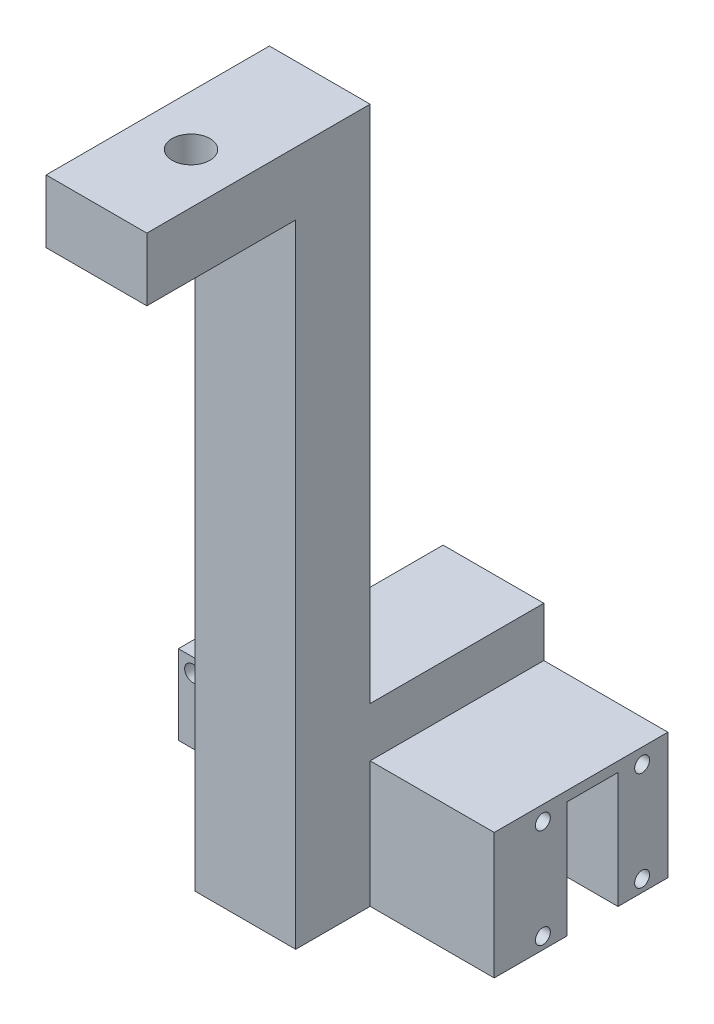
ISO-10303-21;
HEADER;
FILE_DESCRIPTION(('STEP AP214'),'2;1');
FILE_NAME('part.step','',(''),(''),'','','');
FILE_SCHEMA(('AUTOMOTIVE_DESIGN { 1 0 10303 214 1 1 1 1 }'));
ENDSEC;
DATA;
#1=APPLICATION_CONTEXT('core data for automotive mechanical design processes');
#2=APPLICATION_PROTOCOL_DEFINITION('international standard','automotive_design',2000,#1);
#3=PRODUCT_CONTEXT('',#1,'mechanical');
#4=PRODUCT('Part','Part','',(#3));
#5=PRODUCT_RELATED_PRODUCT_CATEGORY('part','',(#4));
#6=PRODUCT_DEFINITION_FORMATION('','',#4);
#7=PRODUCT_DEFINITION_CONTEXT('part definition',#1,'design');
#8=PRODUCT_DEFINITION('design','',#6,#7);
#9=PRODUCT_DEFINITION_SHAPE('','',#8);
#10=(LENGTH_UNIT() NAMED_UNIT(*) SI_UNIT(.MILLI.,.METRE.));
#11=(NAMED_UNIT(*) PLANE_ANGLE_UNIT() SI_UNIT($,.RADIAN.));
#12=(NAMED_UNIT(*) SI_UNIT($,.STERADIAN.) SOLID_ANGLE_UNIT());
#13=UNCERTAINTY_MEASURE_WITH_UNIT(LENGTH_MEASURE(1.E-05),#10,'distance_accuracy_value','');
#14=(GEOMETRIC_REPRESENTATION_CONTEXT(3) GLOBAL_UNCERTAINTY_ASSIGNED_CONTEXT((#13)) GLOBAL_UNIT_ASSIGNED_CONTEXT((#10,
#11,#12)) REPRESENTATION_CONTEXT('',''));
#15=CARTESIAN_POINT('',(0.,0.,0.));
#16=DIRECTION('',(0.,0.,1.));
#17=DIRECTION('',(1.,0.,0.));
#18=AXIS2_PLACEMENT_3D('',#15,#16,#17);
#19=CARTESIAN_POINT('',(5.,0.,30.));
#20=DIRECTION('',(0.,0.,1.));
#21=DIRECTION('',(1.,0.,0.));
#22=AXIS2_PLACEMENT_3D('',#19,#20,#21);
#23=PLANE('',#22);
#24=DIRECTION('',(0.,1.,0.));
#25=VECTOR('',#24,1.);
#26=CARTESIAN_POINT('',(20.3,0.,30.));
#27=LINE('',#26,#25);
#28=CARTESIAN_POINT('',(20.3,35.4,30.));
#29=VERTEX_POINT('',#28);
#30=CARTESIAN_POINT('',(20.3,140.,30.));
#31=VERTEX_POINT('',#30);
#32=EDGE_CURVE('E885',#29,#31,#27,.T.);
#33=ORIENTED_EDGE('',*,*,#32,.F.);
#34=DIRECTION('',(-1.,0.,0.));
#35=VECTOR('',#34,1.);
#36=CARTESIAN_POINT('',(5.,35.4,30.));
#37=LINE('',#36,#35);
#38=CARTESIAN_POINT('',(0.,35.4,30.));
#39=VERTEX_POINT('',#38);
#40=EDGE_CURVE('E957',#29,#39,#37,.T.);
#41=ORIENTED_EDGE('',*,*,#40,.T.);
#42=DIRECTION('',(0.,1.,0.));
#43=VECTOR('',#42,1.);
#44=CARTESIAN_POINT('',(0.,0.,30.));
#45=LINE('',#44,#43);
#46=CARTESIAN_POINT('',(0.,140.,30.));
#47=VERTEX_POINT('',#46);
#48=EDGE_CURVE('E939',#39,#47,#45,.T.);
#49=ORIENTED_EDGE('',*,*,#48,.T.);
#50=DIRECTION('',(-1.,0.,0.));
#51=VECTOR('',#50,1.);
#52=CARTESIAN_POINT('',(5.,140.,30.));
#53=LINE('',#52,#51);
#54=EDGE_CURVE('E954',#31,#47,#53,.T.);
#55=ORIENTED_EDGE('',*,*,#54,.F.);
#56=EDGE_LOOP('',(#33,#41,#49,#55));
#57=FACE_BOUND('',#56,.T.);
#58=ADVANCED_FACE('F537',(#57),#23,.F.);
#59=CARTESIAN_POINT('',(20.3,0.,0.));
#60=DIRECTION('',(-1.,0.,0.));
#61=DIRECTION('',(0.,0.,1.));
#62=AXIS2_PLACEMENT_3D('',#59,#60,#61);
#63=PLANE('',#62);
#64=DIRECTION('',(0.,-1.,0.));
#65=VECTOR('',#64,1.);
#66=CARTESIAN_POINT('',(20.3,0.,5.05));
#67=LINE('',#66,#65);
#68=CARTESIAN_POINT('',(20.3,18.4,5.05));
#69=VERTEX_POINT('',#68);
#70=CARTESIAN_POINT('',(20.3,15.,5.05));
#71=VERTEX_POINT('',#70);
#72=EDGE_CURVE('E12',#69,#71,#67,.T.);
#73=ORIENTED_EDGE('',*,*,#72,.F.);
#74=DIRECTION('',(0.,0.,-1.));
#75=VECTOR('',#74,1.);
#76=CARTESIAN_POINT('',(20.3,18.4,0.));
#77=LINE('',#76,#75);
#78=CARTESIAN_POINT('',(20.3,18.4,15.35));
#79=VERTEX_POINT('',#78);
#80=EDGE_CURVE('E874',#79,#69,#77,.T.);
#81=ORIENTED_EDGE('',*,*,#80,.F.);
#82=DIRECTION('',(0.,1.,0.));
#83=VECTOR('',#82,1.);
#84=CARTESIAN_POINT('',(20.3,0.,15.35));
#85=LINE('',#84,#83);
#86=CARTESIAN_POINT('',(20.3,15.,15.35));
#87=VERTEX_POINT('',#86);
#88=EDGE_CURVE('E546',#87,#79,#85,.T.);
#89=ORIENTED_EDGE('',*,*,#88,.F.);
#90=DIRECTION('',(0.,0.,-1.));
#91=VECTOR('',#90,1.);
#92=CARTESIAN_POINT('',(20.3,15.,0.));
#93=LINE('',#92,#91);
#94=EDGE_CURVE('E902',#87,#71,#93,.T.);
#95=ORIENTED_EDGE('',*,*,#94,.T.);
#96=EDGE_LOOP('',(#73,#81,#89,#95));
#97=FACE_BOUND('',#96,.T.);
#98=ADVANCED_FACE('F1010',(#97),#63,.F.);
#99=CARTESIAN_POINT('',(0.,0.,0.));
#100=DIRECTION('',(1.,0.,0.));
#101=DIRECTION('',(0.,0.,-1.));
#102=AXIS2_PLACEMENT_3D('',#99,#100,#101);
#103=PLANE('',#102);
#104=CARTESIAN_POINT('',(0.,22.4,0.194999999999997));
#105=DIRECTION('',(1.,0.,0.));
#106=DIRECTION('',(0.,0.,-1.));
#107=AXIS2_PLACEMENT_3D('',#104,#105,#106);
#108=CIRCLE('',#107,1.5);
#109=CARTESIAN_POINT('',(0.,22.4,-1.305));
#110=VERTEX_POINT('',#109);
#111=EDGE_CURVE('E910',#110,#110,#108,.T.);
#112=ORIENTED_EDGE('',*,*,#111,.T.);
#113=EDGE_LOOP('',(#112));
#114=FACE_BOUND('',#113,.T.);
#115=CARTESIAN_POINT('',(0.,22.4,20.195));
#116=DIRECTION('',(1.,0.,0.));
#117=DIRECTION('',(0.,0.,-1.));
#118=AXIS2_PLACEMENT_3D('',#115,#116,#117);
#119=CIRCLE('',#118,1.5);
#120=CARTESIAN_POINT('',(0.,22.4,18.695));
#121=VERTEX_POINT('',#120);
#122=EDGE_CURVE('E949',#121,#121,#119,.T.);
#123=ORIENTED_EDGE('',*,*,#122,.T.);
#124=EDGE_LOOP('',(#123));
#125=FACE_BOUND('',#124,.T.);
#126=ORIENTED_EDGE('',*,*,#48,.F.);
#127=DIRECTION('',(0.,0.,1.));
#128=VECTOR('',#127,1.);
#129=CARTESIAN_POINT('',(0.,35.4,0.));
#130=LINE('',#129,#128);
#131=CARTESIAN_POINT('',(0.,35.4,-5.));
#132=VERTEX_POINT('',#131);
#133=EDGE_CURVE('E936',#132,#39,#130,.T.);
#134=ORIENTED_EDGE('',*,*,#133,.F.);
#135=DIRECTION('',(0.,1.,0.));
#136=VECTOR('',#135,1.);
#137=CARTESIAN_POINT('',(0.,0.,-5.));
#138=LINE('',#137,#136);
#139=CARTESIAN_POINT('',(0.,0.,-5.));
#140=VERTEX_POINT('',#139);
#141=EDGE_CURVE('E934',#140,#132,#138,.T.);
#142=ORIENTED_EDGE('',*,*,#141,.F.);
#143=DIRECTION('',(0.,0.,-1.));
#144=VECTOR('',#143,1.);
#145=CARTESIAN_POINT('',(0.,0.,0.));
#146=LINE('',#145,#144);
#147=CARTESIAN_POINT('',(0.,0.,0.));
#148=VERTEX_POINT('',#147);
#149=EDGE_CURVE('E734',#148,#140,#146,.T.);
#150=ORIENTED_EDGE('',*,*,#149,.F.);
#151=DIRECTION('',(0.,-1.,0.));
#152=VECTOR('',#151,1.);
#153=CARTESIAN_POINT('',(0.,0.,0.));
#154=LINE('',#153,#152);
#155=CARTESIAN_POINT('',(0.,0.912729009225285,0.));
#156=VERTEX_POINT('',#155);
#157=EDGE_CURVE('E780',#156,#148,#154,.T.);
#158=ORIENTED_EDGE('',*,*,#157,.F.);
#159=CARTESIAN_POINT('',(0.,2.4,0.194999999999997));
#160=DIRECTION('',(1.,0.,0.));
#161=DIRECTION('',(0.,0.,-1.));
#162=AXIS2_PLACEMENT_3D('',#159,#160,#161);
#163=CIRCLE('',#162,1.5);
#164=CARTESIAN_POINT('',(0.,3.88727099077471,0.));
#165=VERTEX_POINT('',#164);
#166=EDGE_CURVE('E907',#156,#165,#163,.T.);
#167=ORIENTED_EDGE('',*,*,#166,.T.);
#168=CARTESIAN_POINT('',(0.,16.,0.));
#169=VERTEX_POINT('',#168);
#170=EDGE_CURVE('E863',#169,#165,#154,.T.);
#171=ORIENTED_EDGE('',*,*,#170,.F.);
#172=DIRECTION('',(0.,0.,-1.));
#173=VECTOR('',#172,1.);
#174=CARTESIAN_POINT('',(0.,16.,5.));
#175=LINE('',#174,#173);
#176=CARTESIAN_POINT('',(0.,16.,5.));
#177=VERTEX_POINT('',#176);
#178=EDGE_CURVE('E851',#177,#169,#175,.T.);
#179=ORIENTED_EDGE('',*,*,#178,.F.);
#180=DIRECTION('',(0.,-1.,0.));
#181=VECTOR('',#180,1.);
#182=CARTESIAN_POINT('',(0.,0.,5.));
#183=LINE('',#182,#181);
#184=CARTESIAN_POINT('',(0.,0.,5.));
#185=VERTEX_POINT('',#184);
#186=EDGE_CURVE('E845',#177,#185,#183,.T.);
#187=ORIENTED_EDGE('',*,*,#186,.T.);
#188=CARTESIAN_POINT('',(0.,0.,5.05));
#189=VERTEX_POINT('',#188);
#190=EDGE_CURVE('E932',#189,#185,#146,.T.);
#191=ORIENTED_EDGE('',*,*,#190,.F.);
#192=DIRECTION('',(0.,-1.,0.));
#193=VECTOR('',#192,1.);
#194=CARTESIAN_POINT('',(0.,0.,5.05));
#195=LINE('',#194,#193);
#196=CARTESIAN_POINT('',(0.,23.4,5.05));
#197=VERTEX_POINT('',#196);
#198=EDGE_CURVE('E929',#197,#189,#195,.T.);
#199=ORIENTED_EDGE('',*,*,#198,.F.);
#200=DIRECTION('',(0.,0.,-1.));
#201=VECTOR('',#200,1.);
#202=CARTESIAN_POINT('',(0.,23.4,0.));
#203=LINE('',#202,#201);
#204=CARTESIAN_POINT('',(0.,23.4,15.35));
#205=VERTEX_POINT('',#204);
#206=EDGE_CURVE('E926',#205,#197,#203,.T.);
#207=ORIENTED_EDGE('',*,*,#206,.F.);
#208=DIRECTION('',(0.,1.,0.));
#209=VECTOR('',#208,1.);
#210=CARTESIAN_POINT('',(0.,0.,15.35));
#211=LINE('',#210,#209);
#212=CARTESIAN_POINT('',(0.,16.,15.35));
#213=VERTEX_POINT('',#212);
#214=EDGE_CURVE('E924',#213,#205,#211,.T.);
#215=ORIENTED_EDGE('',*,*,#214,.F.);
#216=DIRECTION('',(0.,0.,-1.));
#217=VECTOR('',#216,1.);
#218=CARTESIAN_POINT('',(0.,16.,20.35));
#219=LINE('',#218,#217);
#220=CARTESIAN_POINT('',(0.,16.,20.35));
#221=VERTEX_POINT('',#220);
#222=EDGE_CURVE('E826',#221,#213,#219,.T.);
#223=ORIENTED_EDGE('',*,*,#222,.F.);
#224=DIRECTION('',(0.,1.,0.));
#225=VECTOR('',#224,1.);
#226=CARTESIAN_POINT('',(0.,0.,20.35));
#227=LINE('',#226,#225);
#228=CARTESIAN_POINT('',(0.,3.89197017396461,20.35));
#229=VERTEX_POINT('',#228);
#230=EDGE_CURVE('E816',#229,#221,#227,.T.);
#231=ORIENTED_EDGE('',*,*,#230,.F.);
#232=CARTESIAN_POINT('',(0.,2.4,20.195));
#233=DIRECTION('',(1.,0.,0.));
#234=DIRECTION('',(0.,0.,-1.));
#235=AXIS2_PLACEMENT_3D('',#232,#233,#234);
#236=CIRCLE('',#235,1.5);
#237=CARTESIAN_POINT('',(0.,0.908029826035385,20.35));
#238=VERTEX_POINT('',#237);
#239=EDGE_CURVE('E946',#229,#238,#236,.T.);
#240=ORIENTED_EDGE('',*,*,#239,.T.);
#241=CARTESIAN_POINT('',(0.,0.,20.35));
#242=VERTEX_POINT('',#241);
#243=EDGE_CURVE('E817',#242,#238,#227,.T.);
#244=ORIENTED_EDGE('',*,*,#243,.F.);
#245=DIRECTION('',(0.,0.,1.));
#246=VECTOR('',#245,1.);
#247=CARTESIAN_POINT('',(0.,0.,0.));
#248=LINE('',#247,#246);
#249=CARTESIAN_POINT('',(0.,0.,45.));
#250=VERTEX_POINT('',#249);
#251=EDGE_CURVE('E922',#242,#250,#248,.T.);
#252=ORIENTED_EDGE('',*,*,#251,.T.);
#253=DIRECTION('',(0.,1.,0.));
#254=VECTOR('',#253,1.);
#255=CARTESIAN_POINT('',(0.,0.,45.));
#256=LINE('',#255,#254);
#257=CARTESIAN_POINT('',(0.,127.3,45.));
#258=VERTEX_POINT('',#257);
#259=EDGE_CURVE('E919',#250,#258,#256,.T.);
#260=ORIENTED_EDGE('',*,*,#259,.T.);
#261=DIRECTION('',(0.,0.,1.));
#262=VECTOR('',#261,1.);
#263=CARTESIAN_POINT('',(0.,127.3,0.));
#264=LINE('',#263,#262);
#265=CARTESIAN_POINT('',(0.,127.3,75.));
#266=VERTEX_POINT('',#265);
#267=EDGE_CURVE('E916',#258,#266,#264,.T.);
#268=ORIENTED_EDGE('',*,*,#267,.T.);
#269=DIRECTION('',(0.,1.,0.));
#270=VECTOR('',#269,1.);
#271=CARTESIAN_POINT('',(0.,0.,75.));
#272=LINE('',#271,#270);
#273=CARTESIAN_POINT('',(0.,140.,75.));
#274=VERTEX_POINT('',#273);
#275=EDGE_CURVE('E913',#266,#274,#272,.T.);
#276=ORIENTED_EDGE('',*,*,#275,.T.);
#277=DIRECTION('',(0.,0.,1.));
#278=VECTOR('',#277,1.);
#279=CARTESIAN_POINT('',(0.,140.,0.));
#280=LINE('',#279,#278);
#281=EDGE_CURVE('E942',#47,#274,#280,.T.);
#282=ORIENTED_EDGE('',*,*,#281,.F.);
#283=EDGE_LOOP('',(#126,#134,#142,#150,#158,#167,#171,#179,#187,#191,#199,#207,#215,#223,#231,
#240,#244,#252,#260,#268,#276,#282));
#284=FACE_BOUND('',#283,.T.);
#285=ADVANCED_FACE('F989',(#114,#125,#284),#103,.F.);
#286=CARTESIAN_POINT('',(5.,0.,75.));
#287=DIRECTION('',(0.,0.,1.));
#288=DIRECTION('',(1.,0.,0.));
#289=AXIS2_PLACEMENT_3D('',#286,#287,#288);
#290=PLANE('',#289);
#291=ORIENTED_EDGE('',*,*,#275,.F.);
#292=DIRECTION('',(-1.,0.,0.));
#293=VECTOR('',#292,1.);
#294=CARTESIAN_POINT('',(5.,127.3,75.));
#295=LINE('',#294,#293);
#296=CARTESIAN_POINT('',(20.3,127.3,75.));
#297=VERTEX_POINT('',#296);
#298=EDGE_CURVE('E541',#297,#266,#295,.T.);
#299=ORIENTED_EDGE('',*,*,#298,.F.);
#300=DIRECTION('',(0.,1.,0.));
#301=VECTOR('',#300,1.);
#302=CARTESIAN_POINT('',(20.3,0.,75.));
#303=LINE('',#302,#301);
#304=CARTESIAN_POINT('',(20.3,140.,75.));
#305=VERTEX_POINT('',#304);
#306=EDGE_CURVE('E891',#297,#305,#303,.T.);
#307=ORIENTED_EDGE('',*,*,#306,.T.);
#308=DIRECTION('',(-1.,0.,0.));
#309=VECTOR('',#308,1.);
#310=CARTESIAN_POINT('',(5.,140.,75.));
#311=LINE('',#310,#309);
#312=EDGE_CURVE('E952',#305,#274,#311,.T.);
#313=ORIENTED_EDGE('',*,*,#312,.T.);
#314=EDGE_LOOP('',(#291,#299,#307,#313));
#315=FACE_BOUND('',#314,.T.);
#316=ADVANCED_FACE('F1054',(#315),#290,.T.);
#317=CARTESIAN_POINT('',(5.,127.3,0.));
#318=DIRECTION('',(0.,-1.,0.));
#319=DIRECTION('',(0.,0.,-1.));
#320=AXIS2_PLACEMENT_3D('',#317,#318,#319);
#321=PLANE('',#320);
#322=CARTESIAN_POINT('',(10.15,127.3,55.95));
#323=DIRECTION('',(0.,-1.,0.));
#324=DIRECTION('',(0.,0.,-1.));
#325=AXIS2_PLACEMENT_3D('',#322,#323,#324);
#326=CIRCLE('',#325,3.81);
#327=CARTESIAN_POINT('',(10.15,127.3,52.14));
#328=VERTEX_POINT('',#327);
#329=EDGE_CURVE('E783',#328,#328,#326,.T.);
#330=ORIENTED_EDGE('',*,*,#329,.F.);
#331=EDGE_LOOP('',(#330));
#332=FACE_BOUND('',#331,.T.);
#333=ORIENTED_EDGE('',*,*,#267,.F.);
#334=DIRECTION('',(-1.,0.,0.));
#335=VECTOR('',#334,1.);
#336=CARTESIAN_POINT('',(5.,127.3,45.));
#337=LINE('',#336,#335);
#338=CARTESIAN_POINT('',(20.3,127.3,45.));
#339=VERTEX_POINT('',#338);
#340=EDGE_CURVE('E973',#339,#258,#337,.T.);
#341=ORIENTED_EDGE('',*,*,#340,.F.);
#342=DIRECTION('',(0.,0.,1.));
#343=VECTOR('',#342,1.);
#344=CARTESIAN_POINT('',(20.3,127.3,0.));
#345=LINE('',#344,#343);
#346=EDGE_CURVE('E894',#339,#297,#345,.T.);
#347=ORIENTED_EDGE('',*,*,#346,.T.);
#348=ORIENTED_EDGE('',*,*,#298,.T.);
#349=EDGE_LOOP('',(#333,#341,#347,#348));
#350=FACE_BOUND('',#349,.T.);
#351=ADVANCED_FACE('F1051',(#332,#350),#321,.T.);
#352=CARTESIAN_POINT('',(5.,0.,45.));
#353=DIRECTION('',(0.,0.,1.));
#354=DIRECTION('',(1.,0.,0.));
#355=AXIS2_PLACEMENT_3D('',#352,#353,#354);
#356=PLANE('',#355);
#357=ORIENTED_EDGE('',*,*,#259,.F.);
#358=DIRECTION('',(-1.,0.,0.));
#359=VECTOR('',#358,1.);
#360=CARTESIAN_POINT('',(5.,0.,45.));
#361=LINE('',#360,#359);
#362=CARTESIAN_POINT('',(20.3,0.,45.));
#363=VERTEX_POINT('',#362);
#364=EDGE_CURVE('E971',#363,#250,#361,.T.);
#365=ORIENTED_EDGE('',*,*,#364,.F.);
#366=DIRECTION('',(0.,1.,0.));
#367=VECTOR('',#366,1.);
#368=CARTESIAN_POINT('',(20.3,0.,45.));
#369=LINE('',#368,#367);
#370=EDGE_CURVE('E897',#363,#339,#369,.T.);
#371=ORIENTED_EDGE('',*,*,#370,.T.);
#372=ORIENTED_EDGE('',*,*,#340,.T.);
#373=EDGE_LOOP('',(#357,#365,#371,#372));
#374=FACE_BOUND('',#373,.T.);
#375=ADVANCED_FACE('F1047',(#374),#356,.T.);
#376=CARTESIAN_POINT('',(5.,0.,0.));
#377=DIRECTION('',(0.,-1.,0.));
#378=DIRECTION('',(0.,0.,-1.));
#379=AXIS2_PLACEMENT_3D('',#376,#377,#378);
#380=PLANE('',#379);
#381=ORIENTED_EDGE('',*,*,#251,.F.);
#382=DIRECTION('',(-1.,0.,0.));
#383=VECTOR('',#382,1.);
#384=CARTESIAN_POINT('',(5.,0.,20.35));
#385=LINE('',#384,#383);
#386=CARTESIAN_POINT('',(-28.,0.,20.35));
#387=VERTEX_POINT('',#386);
#388=EDGE_CURVE('E807',#242,#387,#385,.T.);
#389=ORIENTED_EDGE('',*,*,#388,.T.);
#390=DIRECTION('',(0.,0.,-1.));
#391=VECTOR('',#390,1.);
#392=CARTESIAN_POINT('',(-28.,0.,20.35));
#393=LINE('',#392,#391);
#394=CARTESIAN_POINT('',(-28.,0.,15.35));
#395=VERTEX_POINT('',#394);
#396=EDGE_CURVE('E820',#387,#395,#393,.T.);
#397=ORIENTED_EDGE('',*,*,#396,.T.);
#398=DIRECTION('',(-1.,0.,0.));
#399=VECTOR('',#398,1.);
#400=CARTESIAN_POINT('',(5.,0.,15.35));
#401=LINE('',#400,#399);
#402=CARTESIAN_POINT('',(45.3,0.,15.35));
#403=VERTEX_POINT('',#402);
#404=EDGE_CURVE('E969',#403,#395,#401,.T.);
#405=ORIENTED_EDGE('',*,*,#404,.F.);
#406=DIRECTION('',(0.,0.,-1.));
#407=VECTOR('',#406,1.);
#408=CARTESIAN_POINT('',(45.3,0.,0.));
#409=LINE('',#408,#407);
#410=CARTESIAN_POINT('',(45.3,0.,30.));
#411=VERTEX_POINT('',#410);
#412=EDGE_CURVE('E770',#411,#403,#409,.T.);
#413=ORIENTED_EDGE('',*,*,#412,.F.);
#414=DIRECTION('',(-1.,0.,0.));
#415=VECTOR('',#414,1.);
#416=CARTESIAN_POINT('',(45.3,0.,30.));
#417=LINE('',#416,#415);
#418=CARTESIAN_POINT('',(20.3,0.,30.));
#419=VERTEX_POINT('',#418);
#420=EDGE_CURVE('E777',#411,#419,#417,.T.);
#421=ORIENTED_EDGE('',*,*,#420,.T.);
#422=DIRECTION('',(0.,0.,-1.));
#423=VECTOR('',#422,1.);
#424=CARTESIAN_POINT('',(20.3,0.,0.));
#425=LINE('',#424,#423);
#426=EDGE_CURVE('E900',#363,#419,#425,.T.);
#427=ORIENTED_EDGE('',*,*,#426,.F.);
#428=ORIENTED_EDGE('',*,*,#364,.T.);
#429=EDGE_LOOP('',(#381,#389,#397,#405,#413,#421,#427,#428));
#430=FACE_BOUND('',#429,.T.);
#431=ADVANCED_FACE('F1044',(#430),#380,.T.);
#432=CARTESIAN_POINT('',(5.,0.,15.35));
#433=DIRECTION('',(0.,0.,1.));
#434=DIRECTION('',(1.,0.,0.));
#435=AXIS2_PLACEMENT_3D('',#432,#433,#434);
#436=PLANE('',#435);
#437=DIRECTION('',(0.,-1.,0.));
#438=VECTOR('',#437,1.);
#439=CARTESIAN_POINT('',(10.3,0.,15.35));
#440=LINE('',#439,#438);
#441=CARTESIAN_POINT('',(10.3,18.4,15.35));
#442=VERTEX_POINT('',#441);
#443=CARTESIAN_POINT('',(10.3,15.,15.35));
#444=VERTEX_POINT('',#443);
#445=EDGE_CURVE('E1081',#442,#444,#440,.T.);
#446=ORIENTED_EDGE('',*,*,#445,.T.);
#447=DIRECTION('',(-1.,0.,0.));
#448=VECTOR('',#447,1.);
#449=CARTESIAN_POINT('',(20.3,15.,15.35));
#450=LINE('',#449,#448);
#451=EDGE_CURVE('E554',#87,#444,#450,.T.);
#452=ORIENTED_EDGE('',*,*,#451,.F.);
#453=ORIENTED_EDGE('',*,*,#88,.T.);
#454=DIRECTION('',(-1.,0.,0.));
#455=VECTOR('',#454,1.);
#456=CARTESIAN_POINT('',(20.3,18.4,15.35));
#457=LINE('',#456,#455);
#458=EDGE_CURVE('E561',#79,#442,#457,.T.);
#459=ORIENTED_EDGE('',*,*,#458,.T.);
#460=EDGE_LOOP('',(#446,#452,#453,#459));
#461=FACE_BOUND('',#460,.T.);
#462=ORIENTED_EDGE('',*,*,#404,.T.);
#463=DIRECTION('',(0.,1.,0.));
#464=VECTOR('',#463,1.);
#465=CARTESIAN_POINT('',(-28.,0.,15.35));
#466=LINE('',#465,#464);
#467=CARTESIAN_POINT('',(-28.,16.,15.35));
#468=VERTEX_POINT('',#467);
#469=EDGE_CURVE('E804',#395,#468,#466,.T.);
#470=ORIENTED_EDGE('',*,*,#469,.T.);
#471=DIRECTION('',(-1.,0.,0.));
#472=VECTOR('',#471,1.);
#473=CARTESIAN_POINT('',(5.,16.,15.35));
#474=LINE('',#473,#472);
#475=EDGE_CURVE('E811',#213,#468,#474,.T.);
#476=ORIENTED_EDGE('',*,*,#475,.F.);
#477=ORIENTED_EDGE('',*,*,#214,.T.);
#478=DIRECTION('',(-1.,0.,0.));
#479=VECTOR('',#478,1.);
#480=CARTESIAN_POINT('',(5.,23.4,15.35));
#481=LINE('',#480,#479);
#482=CARTESIAN_POINT('',(45.3,23.4,15.35));
#483=VERTEX_POINT('',#482);
#484=EDGE_CURVE('E966',#483,#205,#481,.T.);
#485=ORIENTED_EDGE('',*,*,#484,.F.);
#486=DIRECTION('',(0.,1.,0.));
#487=VECTOR('',#486,1.);
#488=CARTESIAN_POINT('',(45.3,0.,15.35));
#489=LINE('',#488,#487);
#490=EDGE_CURVE('E767',#403,#483,#489,.T.);
#491=ORIENTED_EDGE('',*,*,#490,.F.);
#492=EDGE_LOOP('',(#462,#470,#476,#477,#485,#491));
#493=FACE_BOUND('',#492,.T.);
#494=CARTESIAN_POINT('',(-2.9,2.85,15.35));
#495=DIRECTION('',(0.,0.,1.));
#496=DIRECTION('',(1.,0.,0.));
#497=AXIS2_PLACEMENT_3D('',#494,#495,#496);
#498=CIRCLE('',#497,1.625);
#499=CARTESIAN_POINT('',(-1.275,2.85,15.35));
#500=VERTEX_POINT('',#499);
#501=EDGE_CURVE('E798',#500,#500,#498,.T.);
#502=ORIENTED_EDGE('',*,*,#501,.T.);
#503=EDGE_LOOP('',(#502));
#504=FACE_BOUND('',#503,.T.);
#505=CARTESIAN_POINT('',(-25.1,13.15,15.35));
#506=DIRECTION('',(0.,0.,1.));
#507=DIRECTION('',(1.,0.,0.));
#508=AXIS2_PLACEMENT_3D('',#505,#506,#507);
#509=CIRCLE('',#508,1.625);
#510=CARTESIAN_POINT('',(-23.475,13.15,15.35));
#511=VERTEX_POINT('',#510);
#512=EDGE_CURVE('E794',#511,#511,#509,.T.);
#513=ORIENTED_EDGE('',*,*,#512,.T.);
#514=EDGE_LOOP('',(#513));
#515=FACE_BOUND('',#514,.T.);
#516=ADVANCED_FACE('F1040',(#461,#493,#504,#515),#436,.F.);
#517=CARTESIAN_POINT('',(5.,23.4,0.));
#518=DIRECTION('',(0.,1.,0.));
#519=DIRECTION('',(0.,0.,1.));
#520=AXIS2_PLACEMENT_3D('',#517,#518,#519);
#521=PLANE('',#520);
#522=ORIENTED_EDGE('',*,*,#206,.T.);
#523=DIRECTION('',(-1.,0.,0.));
#524=VECTOR('',#523,1.);
#525=CARTESIAN_POINT('',(5.,23.4,5.05));
#526=LINE('',#525,#524);
#527=CARTESIAN_POINT('',(45.3,23.4,5.05));
#528=VERTEX_POINT('',#527);
#529=EDGE_CURVE('E963',#528,#197,#526,.T.);
#530=ORIENTED_EDGE('',*,*,#529,.F.);
#531=DIRECTION('',(0.,0.,-1.));
#532=VECTOR('',#531,1.);
#533=CARTESIAN_POINT('',(45.3,23.4,0.));
#534=LINE('',#533,#532);
#535=EDGE_CURVE('E765',#483,#528,#534,.T.);
#536=ORIENTED_EDGE('',*,*,#535,.F.);
#537=ORIENTED_EDGE('',*,*,#484,.T.);
#538=EDGE_LOOP('',(#522,#530,#536,#537));
#539=FACE_BOUND('',#538,.T.);
#540=ADVANCED_FACE('F1036',(#539),#521,.F.);
#541=CARTESIAN_POINT('',(5.,0.,5.05));
#542=DIRECTION('',(0.,0.,-1.));
#543=DIRECTION('',(-1.,0.,0.));
#544=AXIS2_PLACEMENT_3D('',#541,#542,#543);
#545=PLANE('',#544);
#546=DIRECTION('',(-1.,0.,0.));
#547=VECTOR('',#546,1.);
#548=CARTESIAN_POINT('',(20.3,15.,5.05));
#549=LINE('',#548,#547);
#550=CARTESIAN_POINT('',(10.3,15.,5.05));
#551=VERTEX_POINT('',#550);
#552=EDGE_CURVE('E904',#71,#551,#549,.T.);
#553=ORIENTED_EDGE('',*,*,#552,.T.);
#554=DIRECTION('',(0.,-1.,0.));
#555=VECTOR('',#554,1.);
#556=CARTESIAN_POINT('',(10.3,0.,5.05000000000001));
#557=LINE('',#556,#555);
#558=CARTESIAN_POINT('',(10.3,18.4,5.05));
#559=VERTEX_POINT('',#558);
#560=EDGE_CURVE('E1086',#559,#551,#557,.T.);
#561=ORIENTED_EDGE('',*,*,#560,.F.);
#562=DIRECTION('',(-1.,0.,0.));
#563=VECTOR('',#562,1.);
#564=CARTESIAN_POINT('',(20.3,18.4,5.05));
#565=LINE('',#564,#563);
#566=EDGE_CURVE('E877',#69,#559,#565,.T.);
#567=ORIENTED_EDGE('',*,*,#566,.F.);
#568=ORIENTED_EDGE('',*,*,#72,.T.);
#569=EDGE_LOOP('',(#553,#561,#567,#568));
#570=FACE_BOUND('',#569,.T.);
#571=ORIENTED_EDGE('',*,*,#198,.T.);
#572=DIRECTION('',(-1.,0.,0.));
#573=VECTOR('',#572,1.);
#574=CARTESIAN_POINT('',(5.,0.,5.05));
#575=LINE('',#574,#573);
#576=CARTESIAN_POINT('',(45.3,0.,5.05));
#577=VERTEX_POINT('',#576);
#578=EDGE_CURVE('E738',#577,#189,#575,.T.);
#579=ORIENTED_EDGE('',*,*,#578,.F.);
#580=DIRECTION('',(0.,-1.,0.));
#581=VECTOR('',#580,1.);
#582=CARTESIAN_POINT('',(45.3,0.,5.05));
#583=LINE('',#582,#581);
#584=EDGE_CURVE('E748',#528,#577,#583,.T.);
#585=ORIENTED_EDGE('',*,*,#584,.F.);
#586=ORIENTED_EDGE('',*,*,#529,.T.);
#587=EDGE_LOOP('',(#571,#579,#585,#586));
#588=FACE_BOUND('',#587,.T.);
#589=ADVANCED_FACE('F1033',(#570,#588),#545,.F.);
#590=CARTESIAN_POINT('',(5.,0.,0.));
#591=DIRECTION('',(0.,1.,0.));
#592=DIRECTION('',(0.,0.,1.));
#593=AXIS2_PLACEMENT_3D('',#590,#591,#592);
#594=PLANE('',#593);
#595=ORIENTED_EDGE('',*,*,#190,.T.);
#596=DIRECTION('',(1.,0.,0.));
#597=VECTOR('',#596,1.);
#598=CARTESIAN_POINT('',(0.,0.,5.));
#599=LINE('',#598,#597);
#600=CARTESIAN_POINT('',(-28.,0.,5.));
#601=VERTEX_POINT('',#600);
#602=EDGE_CURVE('E843',#601,#185,#599,.T.);
#603=ORIENTED_EDGE('',*,*,#602,.F.);
#604=DIRECTION('',(0.,0.,-1.));
#605=VECTOR('',#604,1.);
#606=CARTESIAN_POINT('',(-28.,0.,5.));
#607=LINE('',#606,#605);
#608=CARTESIAN_POINT('',(-28.,0.,0.));
#609=VERTEX_POINT('',#608);
#610=EDGE_CURVE('E869',#601,#609,#607,.T.);
#611=ORIENTED_EDGE('',*,*,#610,.T.);
#612=DIRECTION('',(1.,0.,0.));
#613=VECTOR('',#612,1.);
#614=CARTESIAN_POINT('',(0.,0.,0.));
#615=LINE('',#614,#613);
#616=EDGE_CURVE('E860',#609,#148,#615,.T.);
#617=ORIENTED_EDGE('',*,*,#616,.T.);
#618=ORIENTED_EDGE('',*,*,#149,.T.);
#619=DIRECTION('',(-1.,0.,0.));
#620=VECTOR('',#619,1.);
#621=CARTESIAN_POINT('',(5.,0.,-5.));
#622=LINE('',#621,#620);
#623=CARTESIAN_POINT('',(45.3,0.,-5.));
#624=VERTEX_POINT('',#623);
#625=EDGE_CURVE('E726',#624,#140,#622,.T.);
#626=ORIENTED_EDGE('',*,*,#625,.F.);
#627=DIRECTION('',(0.,0.,-1.));
#628=VECTOR('',#627,1.);
#629=CARTESIAN_POINT('',(45.3,0.,0.));
#630=LINE('',#629,#628);
#631=EDGE_CURVE('E731',#577,#624,#630,.T.);
#632=ORIENTED_EDGE('',*,*,#631,.F.);
#633=ORIENTED_EDGE('',*,*,#578,.T.);
#634=EDGE_LOOP('',(#595,#603,#611,#617,#618,#626,#632,#633));
#635=FACE_BOUND('',#634,.T.);
#636=ADVANCED_FACE('F729',(#635),#594,.F.);
#637=CARTESIAN_POINT('',(5.,0.,-5.));
#638=DIRECTION('',(0.,0.,1.));
#639=DIRECTION('',(1.,0.,0.));
#640=AXIS2_PLACEMENT_3D('',#637,#638,#639);
#641=PLANE('',#640);
#642=DIRECTION('',(-1.,0.,0.));
#643=VECTOR('',#642,1.);
#644=CARTESIAN_POINT('',(5.,35.4,-5.));
#645=LINE('',#644,#643);
#646=CARTESIAN_POINT('',(20.3,35.4,-5.));
#647=VERTEX_POINT('',#646);
#648=EDGE_CURVE('E739',#647,#132,#645,.T.);
#649=ORIENTED_EDGE('',*,*,#648,.F.);
#650=DIRECTION('',(0.,-1.,0.));
#651=VECTOR('',#650,1.);
#652=CARTESIAN_POINT('',(20.3,0.,-5.));
#653=LINE('',#652,#651);
#654=CARTESIAN_POINT('',(20.3,25.4,-5.));
#655=VERTEX_POINT('',#654);
#656=EDGE_CURVE('E879',#647,#655,#653,.T.);
#657=ORIENTED_EDGE('',*,*,#656,.T.);
#658=DIRECTION('',(-1.,0.,0.));
#659=VECTOR('',#658,1.);
#660=CARTESIAN_POINT('',(45.3,25.4,-5.));
#661=LINE('',#660,#659);
#662=CARTESIAN_POINT('',(45.3,25.4,-5.));
#663=VERTEX_POINT('',#662);
#664=EDGE_CURVE('E753',#663,#655,#661,.T.);
#665=ORIENTED_EDGE('',*,*,#664,.F.);
#666=DIRECTION('',(0.,-1.,0.));
#667=VECTOR('',#666,1.);
#668=CARTESIAN_POINT('',(45.3,0.,-5.));
#669=LINE('',#668,#667);
#670=EDGE_CURVE('E745',#663,#624,#669,.T.);
#671=ORIENTED_EDGE('',*,*,#670,.T.);
#672=ORIENTED_EDGE('',*,*,#625,.T.);
#673=ORIENTED_EDGE('',*,*,#141,.T.);
#674=EDGE_LOOP('',(#649,#657,#665,#671,#672,#673));
#675=FACE_BOUND('',#674,.T.);
#676=ADVANCED_FACE('F750',(#675),#641,.F.);
#677=CARTESIAN_POINT('',(5.,35.4,0.));
#678=DIRECTION('',(0.,-1.,0.));
#679=DIRECTION('',(0.,0.,-1.));
#680=AXIS2_PLACEMENT_3D('',#677,#678,#679);
#681=PLANE('',#680);
#682=ORIENTED_EDGE('',*,*,#133,.T.);
#683=ORIENTED_EDGE('',*,*,#40,.F.);
#684=DIRECTION('',(0.,0.,1.));
#685=VECTOR('',#684,1.);
#686=CARTESIAN_POINT('',(20.3,35.4,0.));
#687=LINE('',#686,#685);
#688=EDGE_CURVE('E882',#647,#29,#687,.T.);
#689=ORIENTED_EDGE('',*,*,#688,.F.);
#690=ORIENTED_EDGE('',*,*,#648,.T.);
#691=EDGE_LOOP('',(#682,#683,#689,#690));
#692=FACE_BOUND('',#691,.T.);
#693=ADVANCED_FACE('F1024',(#692),#681,.F.);
#694=CARTESIAN_POINT('',(5.,2.4,20.195));
#695=DIRECTION('',(-1.,0.,0.));
#696=DIRECTION('',(0.,0.,1.));
#697=AXIS2_PLACEMENT_3D('',#694,#695,#696);
#698=CYLINDRICAL_SURFACE('',#697,1.5);
#699=ORIENTED_EDGE('',*,*,#239,.F.);
#700=EDGE_CURVE('E945',#238,#229,#236,.T.);
#701=ORIENTED_EDGE('',*,*,#700,.F.);
#702=EDGE_LOOP('',(#699,#701));
#703=FACE_BOUND('',#702,.T.);
#704=CARTESIAN_POINT('',(45.3,2.4,20.195));
#705=DIRECTION('',(-1.,0.,0.));
#706=DIRECTION('',(0.,0.,1.));
#707=AXIS2_PLACEMENT_3D('',#704,#705,#706);
#708=CIRCLE('',#707,1.5);
#709=CARTESIAN_POINT('',(45.3,2.4,21.695));
#710=VERTEX_POINT('',#709);
#711=EDGE_CURVE('E761',#710,#710,#708,.T.);
#712=ORIENTED_EDGE('',*,*,#711,.F.);
#713=EDGE_LOOP('',(#712));
#714=FACE_BOUND('',#713,.T.);
#715=ADVANCED_FACE('F1027',(#703,#714),#698,.F.);
#716=CARTESIAN_POINT('',(5.,140.,0.));
#717=DIRECTION('',(0.,-1.,0.));
#718=DIRECTION('',(0.,0.,-1.));
#719=AXIS2_PLACEMENT_3D('',#716,#717,#718);
#720=PLANE('',#719);
#721=CARTESIAN_POINT('',(10.15,140.,55.95));
#722=DIRECTION('',(0.,-1.,0.));
#723=DIRECTION('',(0.,0.,-1.));
#724=AXIS2_PLACEMENT_3D('',#721,#722,#723);
#725=CIRCLE('',#724,3.81);
#726=CARTESIAN_POINT('',(10.15,140.,52.14));
#727=VERTEX_POINT('',#726);
#728=EDGE_CURVE('E791',#727,#727,#725,.F.);
#729=ORIENTED_EDGE('',*,*,#728,.F.);
#730=EDGE_LOOP('',(#729));
#731=FACE_BOUND('',#730,.T.);
#732=ORIENTED_EDGE('',*,*,#281,.T.);
#733=ORIENTED_EDGE('',*,*,#312,.F.);
#734=DIRECTION('',(0.,0.,1.));
#735=VECTOR('',#734,1.);
#736=CARTESIAN_POINT('',(20.3,140.,0.));
#737=LINE('',#736,#735);
#738=EDGE_CURVE('E888',#31,#305,#737,.T.);
#739=ORIENTED_EDGE('',*,*,#738,.F.);
#740=ORIENTED_EDGE('',*,*,#54,.T.);
#741=EDGE_LOOP('',(#732,#733,#739,#740));
#742=FACE_BOUND('',#741,.T.);
#743=ADVANCED_FACE('F1022',(#731,#742),#720,.F.);
#744=CARTESIAN_POINT('',(5.,22.4,0.194999999999997));
#745=DIRECTION('',(-1.,0.,0.));
#746=DIRECTION('',(0.,0.,1.));
#747=AXIS2_PLACEMENT_3D('',#744,#745,#746);
#748=CYLINDRICAL_SURFACE('',#747,1.5);
#749=ORIENTED_EDGE('',*,*,#111,.F.);
#750=EDGE_LOOP('',(#749));
#751=FACE_BOUND('',#750,.T.);
#752=CARTESIAN_POINT('',(45.3,22.4,0.194999999999997));
#753=DIRECTION('',(-1.,0.,0.));
#754=DIRECTION('',(0.,0.,1.));
#755=AXIS2_PLACEMENT_3D('',#752,#753,#754);
#756=CIRCLE('',#755,1.5);
#757=CARTESIAN_POINT('',(45.3,22.4,1.695));
#758=VERTEX_POINT('',#757);
#759=EDGE_CURVE('E1071',#758,#758,#756,.T.);
#760=ORIENTED_EDGE('',*,*,#759,.F.);
#761=EDGE_LOOP('',(#760));
#762=FACE_BOUND('',#761,.T.);
#763=ADVANCED_FACE('F1058',(#751,#762),#748,.F.);
#764=CARTESIAN_POINT('',(5.,2.4,0.194999999999997));
#765=DIRECTION('',(-1.,0.,0.));
#766=DIRECTION('',(0.,0.,1.));
#767=AXIS2_PLACEMENT_3D('',#764,#765,#766);
#768=CYLINDRICAL_SURFACE('',#767,1.5);
#769=EDGE_CURVE('E908',#165,#156,#163,.T.);
#770=ORIENTED_EDGE('',*,*,#769,.F.);
#771=ORIENTED_EDGE('',*,*,#166,.F.);
#772=EDGE_LOOP('',(#770,#771));
#773=FACE_BOUND('',#772,.T.);
#774=CARTESIAN_POINT('',(45.3,2.4,0.194999999999997));
#775=DIRECTION('',(-1.,0.,0.));
#776=DIRECTION('',(0.,0.,1.));
#777=AXIS2_PLACEMENT_3D('',#774,#775,#776);
#778=CIRCLE('',#777,1.5);
#779=CARTESIAN_POINT('',(45.3,2.4,1.695));
#780=VERTEX_POINT('',#779);
#781=EDGE_CURVE('E1073',#780,#780,#778,.T.);
#782=ORIENTED_EDGE('',*,*,#781,.F.);
#783=EDGE_LOOP('',(#782));
#784=FACE_BOUND('',#783,.T.);
#785=ADVANCED_FACE('F539',(#773,#784),#768,.F.);
#786=CARTESIAN_POINT('',(5.,22.4,20.195));
#787=DIRECTION('',(-1.,0.,0.));
#788=DIRECTION('',(0.,0.,1.));
#789=AXIS2_PLACEMENT_3D('',#786,#787,#788);
#790=CYLINDRICAL_SURFACE('',#789,1.5);
#791=ORIENTED_EDGE('',*,*,#122,.F.);
#792=EDGE_LOOP('',(#791));
#793=FACE_BOUND('',#792,.T.);
#794=CARTESIAN_POINT('',(45.3,22.4,20.195));
#795=DIRECTION('',(-1.,0.,0.));
#796=DIRECTION('',(0.,0.,1.));
#797=AXIS2_PLACEMENT_3D('',#794,#795,#796);
#798=CIRCLE('',#797,1.5);
#799=CARTESIAN_POINT('',(45.3,22.4,21.695));
#800=VERTEX_POINT('',#799);
#801=EDGE_CURVE('E1076',#800,#800,#798,.T.);
#802=ORIENTED_EDGE('',*,*,#801,.F.);
#803=EDGE_LOOP('',(#802));
#804=FACE_BOUND('',#803,.T.);
#805=ADVANCED_FACE('F1065',(#793,#804),#790,.F.);
#806=CARTESIAN_POINT('',(20.3,15.,0.));
#807=DIRECTION('',(0.,1.,0.));
#808=DIRECTION('',(0.,0.,1.));
#809=AXIS2_PLACEMENT_3D('',#806,#807,#808);
#810=PLANE('',#809);
#811=ORIENTED_EDGE('',*,*,#451,.T.);
#812=DIRECTION('',(0.,0.,-1.));
#813=VECTOR('',#812,1.);
#814=CARTESIAN_POINT('',(10.3,15.,0.));
#815=LINE('',#814,#813);
#816=EDGE_CURVE('E1089',#444,#551,#815,.T.);
#817=ORIENTED_EDGE('',*,*,#816,.T.);
#818=ORIENTED_EDGE('',*,*,#552,.F.);
#819=ORIENTED_EDGE('',*,*,#94,.F.);
#820=EDGE_LOOP('',(#811,#817,#818,#819));
#821=FACE_BOUND('',#820,.T.);
#822=ADVANCED_FACE('F1092',(#821),#810,.F.);
#823=ORIENTED_EDGE('',*,*,#426,.T.);
#824=DIRECTION('',(0.,1.,0.));
#825=VECTOR('',#824,1.);
#826=CARTESIAN_POINT('',(20.3,0.,30.));
#827=LINE('',#826,#825);
#828=CARTESIAN_POINT('',(20.3,25.4,30.));
#829=VERTEX_POINT('',#828);
#830=EDGE_CURVE('E758',#419,#829,#827,.T.);
#831=ORIENTED_EDGE('',*,*,#830,.T.);
#832=DIRECTION('',(0.,0.,1.));
#833=VECTOR('',#832,1.);
#834=CARTESIAN_POINT('',(20.3,25.4,0.));
#835=LINE('',#834,#833);
#836=EDGE_CURVE('E755',#655,#829,#835,.T.);
#837=ORIENTED_EDGE('',*,*,#836,.F.);
#838=ORIENTED_EDGE('',*,*,#656,.F.);
#839=ORIENTED_EDGE('',*,*,#688,.T.);
#840=ORIENTED_EDGE('',*,*,#32,.T.);
#841=ORIENTED_EDGE('',*,*,#738,.T.);
#842=ORIENTED_EDGE('',*,*,#306,.F.);
#843=ORIENTED_EDGE('',*,*,#346,.F.);
#844=ORIENTED_EDGE('',*,*,#370,.F.);
#845=EDGE_LOOP('',(#823,#831,#837,#838,#839,#840,#841,#842,#843,#844));
#846=FACE_BOUND('',#845,.T.);
#847=ADVANCED_FACE('F1018',(#846),#63,.F.);
#848=CARTESIAN_POINT('',(20.3,18.4,0.));
#849=DIRECTION('',(0.,1.,0.));
#850=DIRECTION('',(0.,0.,1.));
#851=AXIS2_PLACEMENT_3D('',#848,#849,#850);
#852=PLANE('',#851);
#853=ORIENTED_EDGE('',*,*,#566,.T.);
#854=DIRECTION('',(0.,0.,-1.));
#855=VECTOR('',#854,1.);
#856=CARTESIAN_POINT('',(10.3,18.4,0.));
#857=LINE('',#856,#855);
#858=EDGE_CURVE('E1083',#442,#559,#857,.T.);
#859=ORIENTED_EDGE('',*,*,#858,.F.);
#860=ORIENTED_EDGE('',*,*,#458,.F.);
#861=ORIENTED_EDGE('',*,*,#80,.T.);
#862=EDGE_LOOP('',(#853,#859,#860,#861));
#863=FACE_BOUND('',#862,.T.);
#864=ADVANCED_FACE('F1101',(#863),#852,.T.);
#865=CARTESIAN_POINT('',(0.,16.,5.));
#866=DIRECTION('',(0.,1.,0.));
#867=DIRECTION('',(-1.,0.,0.));
#868=AXIS2_PLACEMENT_3D('',#865,#866,#867);
#869=PLANE('',#868);
#870=DIRECTION('',(1.,0.,0.));
#871=VECTOR('',#870,1.);
#872=CARTESIAN_POINT('',(0.,16.,0.));
#873=LINE('',#872,#871);
#874=CARTESIAN_POINT('',(-28.,16.,0.));
#875=VERTEX_POINT('',#874);
#876=EDGE_CURVE('E854',#875,#169,#873,.T.);
#877=ORIENTED_EDGE('',*,*,#876,.F.);
#878=DIRECTION('',(0.,0.,-1.));
#879=VECTOR('',#878,1.);
#880=CARTESIAN_POINT('',(-28.,16.,5.));
#881=LINE('',#880,#879);
#882=CARTESIAN_POINT('',(-28.,16.,5.));
#883=VERTEX_POINT('',#882);
#884=EDGE_CURVE('E872',#883,#875,#881,.T.);
#885=ORIENTED_EDGE('',*,*,#884,.F.);
#886=DIRECTION('',(1.,0.,0.));
#887=VECTOR('',#886,1.);
#888=CARTESIAN_POINT('',(0.,16.,5.));
#889=LINE('',#888,#887);
#890=EDGE_CURVE('E837',#883,#177,#889,.T.);
#891=ORIENTED_EDGE('',*,*,#890,.T.);
#892=ORIENTED_EDGE('',*,*,#178,.T.);
#893=EDGE_LOOP('',(#877,#885,#891,#892));
#894=FACE_BOUND('',#893,.T.);
#895=ADVANCED_FACE('F1005',(#894),#869,.T.);
#896=CARTESIAN_POINT('',(-28.,0.,5.));
#897=DIRECTION('',(1.,0.,0.));
#898=DIRECTION('',(0.,0.,-1.));
#899=AXIS2_PLACEMENT_3D('',#896,#897,#898);
#900=PLANE('',#899);
#901=DIRECTION('',(0.,-1.,0.));
#902=VECTOR('',#901,1.);
#903=CARTESIAN_POINT('',(-28.,0.,0.));
#904=LINE('',#903,#902);
#905=EDGE_CURVE('E857',#875,#609,#904,.T.);
#906=ORIENTED_EDGE('',*,*,#905,.T.);
#907=ORIENTED_EDGE('',*,*,#610,.F.);
#908=DIRECTION('',(0.,-1.,0.));
#909=VECTOR('',#908,1.);
#910=CARTESIAN_POINT('',(-28.,0.,5.));
#911=LINE('',#910,#909);
#912=EDGE_CURVE('E840',#883,#601,#911,.T.);
#913=ORIENTED_EDGE('',*,*,#912,.F.);
#914=ORIENTED_EDGE('',*,*,#884,.T.);
#915=EDGE_LOOP('',(#906,#907,#913,#914));
#916=FACE_BOUND('',#915,.T.);
#917=ADVANCED_FACE('F996',(#916),#900,.F.);
#918=CARTESIAN_POINT('',(0.,0.,5.));
#919=DIRECTION('',(1.,0.,0.));
#920=DIRECTION('',(0.,1.,0.));
#921=AXIS2_PLACEMENT_3D('',#918,#919,#920);
#922=PLANE('',#921);
#923=EDGE_CURVE('E862',#165,#156,#154,.T.);
#924=ORIENTED_EDGE('',*,*,#923,.F.);
#925=ORIENTED_EDGE('',*,*,#769,.T.);
#926=EDGE_LOOP('',(#924,#925));
#927=FACE_BOUND('',#926,.T.);
#928=ADVANCED_FACE('F993',(#927),#922,.T.);
#929=CARTESIAN_POINT('',(-2.9,2.85,5.));
#930=DIRECTION('',(0.,0.,-1.));
#931=DIRECTION('',(-1.,0.,0.));
#932=AXIS2_PLACEMENT_3D('',#929,#930,#931);
#933=CYLINDRICAL_SURFACE('',#932,1.625);
#934=CARTESIAN_POINT('',(-2.9,2.85,5.));
#935=DIRECTION('',(0.,0.,1.));
#936=DIRECTION('',(1.,0.,0.));
#937=AXIS2_PLACEMENT_3D('',#934,#935,#936);
#938=CIRCLE('',#937,1.625);
#939=CARTESIAN_POINT('',(-1.275,2.85,5.));
#940=VERTEX_POINT('',#939);
#941=EDGE_CURVE('E834',#940,#940,#938,.F.);
#942=ORIENTED_EDGE('',*,*,#941,.F.);
#943=EDGE_LOOP('',(#942));
#944=FACE_BOUND('',#943,.T.);
#945=CARTESIAN_POINT('',(-2.9,2.85,0.));
#946=DIRECTION('',(0.,0.,1.));
#947=DIRECTION('',(1.,0.,0.));
#948=AXIS2_PLACEMENT_3D('',#945,#946,#947);
#949=CIRCLE('',#948,1.625);
#950=CARTESIAN_POINT('',(-1.275,2.85,0.));
#951=VERTEX_POINT('',#950);
#952=EDGE_CURVE('E829',#951,#951,#949,.F.);
#953=ORIENTED_EDGE('',*,*,#952,.T.);
#954=EDGE_LOOP('',(#953));
#955=FACE_BOUND('',#954,.T.);
#956=ADVANCED_FACE('F995',(#944,#955),#933,.F.);
#957=CARTESIAN_POINT('',(-25.1,13.15,5.));
#958=DIRECTION('',(0.,0.,-1.));
#959=DIRECTION('',(-1.,0.,0.));
#960=AXIS2_PLACEMENT_3D('',#957,#958,#959);
#961=CYLINDRICAL_SURFACE('',#960,1.625);
#962=CARTESIAN_POINT('',(-25.1,13.15,5.));
#963=DIRECTION('',(0.,0.,1.));
#964=DIRECTION('',(1.,0.,0.));
#965=AXIS2_PLACEMENT_3D('',#962,#963,#964);
#966=CIRCLE('',#965,1.625);
#967=CARTESIAN_POINT('',(-23.475,13.15,5.));
#968=VERTEX_POINT('',#967);
#969=EDGE_CURVE('E848',#968,#968,#966,.F.);
#970=ORIENTED_EDGE('',*,*,#969,.F.);
#971=EDGE_LOOP('',(#970));
#972=FACE_BOUND('',#971,.T.);
#973=CARTESIAN_POINT('',(-25.1,13.15,0.));
#974=DIRECTION('',(0.,0.,1.));
#975=DIRECTION('',(1.,0.,0.));
#976=AXIS2_PLACEMENT_3D('',#973,#974,#975);
#977=CIRCLE('',#976,1.625);
#978=CARTESIAN_POINT('',(-23.475,13.15,0.));
#979=VERTEX_POINT('',#978);
#980=EDGE_CURVE('E838',#979,#979,#977,.F.);
#981=ORIENTED_EDGE('',*,*,#980,.T.);
#982=EDGE_LOOP('',(#981));
#983=FACE_BOUND('',#982,.T.);
#984=ADVANCED_FACE('F1002',(#972,#983),#961,.F.);
#985=CARTESIAN_POINT('',(0.,0.,5.));
#986=DIRECTION('',(0.,0.,1.));
#987=DIRECTION('',(1.,0.,0.));
#988=AXIS2_PLACEMENT_3D('',#985,#986,#987);
#989=PLANE('',#988);
#990=ORIENTED_EDGE('',*,*,#941,.T.);
#991=EDGE_LOOP('',(#990));
#992=FACE_BOUND('',#991,.T.);
#993=ORIENTED_EDGE('',*,*,#890,.F.);
#994=ORIENTED_EDGE('',*,*,#912,.T.);
#995=ORIENTED_EDGE('',*,*,#602,.T.);
#996=ORIENTED_EDGE('',*,*,#186,.F.);
#997=EDGE_LOOP('',(#993,#994,#995,#996));
#998=FACE_BOUND('',#997,.T.);
#999=ORIENTED_EDGE('',*,*,#969,.T.);
#1000=EDGE_LOOP('',(#999));
#1001=FACE_BOUND('',#1000,.T.);
#1002=ADVANCED_FACE('F1172',(#992,#998,#1001),#989,.T.);
#1003=CARTESIAN_POINT('',(0.,0.,0.));
#1004=DIRECTION('',(0.,0.,1.));
#1005=DIRECTION('',(1.,0.,0.));
#1006=AXIS2_PLACEMENT_3D('',#1003,#1004,#1005);
#1007=PLANE('',#1006);
#1008=ORIENTED_EDGE('',*,*,#952,.F.);
#1009=EDGE_LOOP('',(#1008));
#1010=FACE_BOUND('',#1009,.T.);
#1011=ORIENTED_EDGE('',*,*,#876,.T.);
#1012=ORIENTED_EDGE('',*,*,#170,.T.);
#1013=ORIENTED_EDGE('',*,*,#923,.T.);
#1014=ORIENTED_EDGE('',*,*,#157,.T.);
#1015=ORIENTED_EDGE('',*,*,#616,.F.);
#1016=ORIENTED_EDGE('',*,*,#905,.F.);
#1017=EDGE_LOOP('',(#1011,#1012,#1013,#1014,#1015,#1016));
#1018=FACE_BOUND('',#1017,.T.);
#1019=ORIENTED_EDGE('',*,*,#980,.F.);
#1020=EDGE_LOOP('',(#1019));
#1021=FACE_BOUND('',#1020,.T.);
#1022=ADVANCED_FACE('F982',(#1010,#1018,#1021),#1007,.F.);
#1023=CARTESIAN_POINT('',(0.,0.,20.35));
#1024=DIRECTION('',(-1.,0.,0.));
#1025=DIRECTION('',(0.,-1.,0.));
#1026=AXIS2_PLACEMENT_3D('',#1023,#1024,#1025);
#1027=PLANE('',#1026);
#1028=ORIENTED_EDGE('',*,*,#700,.T.);
#1029=EDGE_CURVE('E821',#238,#229,#227,.T.);
#1030=ORIENTED_EDGE('',*,*,#1029,.F.);
#1031=EDGE_LOOP('',(#1028,#1030));
#1032=FACE_BOUND('',#1031,.T.);
#1033=ADVANCED_FACE('F1161',(#1032),#1027,.F.);
#1034=CARTESIAN_POINT('',(0.,0.,20.35));
#1035=DIRECTION('',(0.,0.,-1.));
#1036=DIRECTION('',(-1.,0.,0.));
#1037=AXIS2_PLACEMENT_3D('',#1034,#1035,#1036);
#1038=PLANE('',#1037);
#1039=ORIENTED_EDGE('',*,*,#388,.F.);
#1040=ORIENTED_EDGE('',*,*,#243,.T.);
#1041=ORIENTED_EDGE('',*,*,#1029,.T.);
#1042=ORIENTED_EDGE('',*,*,#230,.T.);
#1043=DIRECTION('',(-1.,0.,0.));
#1044=VECTOR('',#1043,1.);
#1045=CARTESIAN_POINT('',(5.,16.,20.35));
#1046=LINE('',#1045,#1044);
#1047=CARTESIAN_POINT('',(-28.,16.,20.35));
#1048=VERTEX_POINT('',#1047);
#1049=EDGE_CURVE('E814',#221,#1048,#1046,.T.);
#1050=ORIENTED_EDGE('',*,*,#1049,.T.);
#1051=DIRECTION('',(0.,1.,0.));
#1052=VECTOR('',#1051,1.);
#1053=CARTESIAN_POINT('',(-28.,0.,20.35));
#1054=LINE('',#1053,#1052);
#1055=EDGE_CURVE('E810',#387,#1048,#1054,.T.);
#1056=ORIENTED_EDGE('',*,*,#1055,.F.);
#1057=EDGE_LOOP('',(#1039,#1040,#1041,#1042,#1050,#1056));
#1058=FACE_BOUND('',#1057,.T.);
#1059=CARTESIAN_POINT('',(-2.9,2.85,20.35));
#1060=DIRECTION('',(0.,0.,1.));
#1061=DIRECTION('',(1.,0.,0.));
#1062=AXIS2_PLACEMENT_3D('',#1059,#1060,#1061);
#1063=CIRCLE('',#1062,1.625);
#1064=CARTESIAN_POINT('',(-1.275,2.85,20.35));
#1065=VERTEX_POINT('',#1064);
#1066=EDGE_CURVE('E801',#1065,#1065,#1063,.T.);
#1067=ORIENTED_EDGE('',*,*,#1066,.F.);
#1068=EDGE_LOOP('',(#1067));
#1069=FACE_BOUND('',#1068,.T.);
#1070=CARTESIAN_POINT('',(-25.1,13.15,20.35));
#1071=DIRECTION('',(0.,0.,1.));
#1072=DIRECTION('',(1.,0.,0.));
#1073=AXIS2_PLACEMENT_3D('',#1070,#1071,#1072);
#1074=CIRCLE('',#1073,1.625);
#1075=CARTESIAN_POINT('',(-23.475,13.15,20.35));
#1076=VERTEX_POINT('',#1075);
#1077=EDGE_CURVE('E795',#1076,#1076,#1074,.T.);
#1078=ORIENTED_EDGE('',*,*,#1077,.F.);
#1079=EDGE_LOOP('',(#1078));
#1080=FACE_BOUND('',#1079,.T.);
#1081=ADVANCED_FACE('F1157',(#1058,#1069,#1080),#1038,.F.);
#1082=CARTESIAN_POINT('',(5.,16.,20.35));
#1083=DIRECTION('',(0.,-1.,0.));
#1084=DIRECTION('',(1.,0.,0.));
#1085=AXIS2_PLACEMENT_3D('',#1082,#1083,#1084);
#1086=PLANE('',#1085);
#1087=ORIENTED_EDGE('',*,*,#475,.T.);
#1088=DIRECTION('',(0.,0.,-1.));
#1089=VECTOR('',#1088,1.);
#1090=CARTESIAN_POINT('',(-28.,16.,20.35));
#1091=LINE('',#1090,#1089);
#1092=EDGE_CURVE('E830',#1048,#468,#1091,.T.);
#1093=ORIENTED_EDGE('',*,*,#1092,.F.);
#1094=ORIENTED_EDGE('',*,*,#1049,.F.);
#1095=ORIENTED_EDGE('',*,*,#222,.T.);
#1096=EDGE_LOOP('',(#1087,#1093,#1094,#1095));
#1097=FACE_BOUND('',#1096,.T.);
#1098=ADVANCED_FACE('F1160',(#1097),#1086,.F.);
#1099=CARTESIAN_POINT('',(-28.,0.,20.35));
#1100=DIRECTION('',(-1.,0.,0.));
#1101=DIRECTION('',(0.,0.,1.));
#1102=AXIS2_PLACEMENT_3D('',#1099,#1100,#1101);
#1103=PLANE('',#1102);
#1104=ORIENTED_EDGE('',*,*,#469,.F.);
#1105=ORIENTED_EDGE('',*,*,#396,.F.);
#1106=ORIENTED_EDGE('',*,*,#1055,.T.);
#1107=ORIENTED_EDGE('',*,*,#1092,.T.);
#1108=EDGE_LOOP('',(#1104,#1105,#1106,#1107));
#1109=FACE_BOUND('',#1108,.T.);
#1110=ADVANCED_FACE('F1155',(#1109),#1103,.T.);
#1111=CARTESIAN_POINT('',(-2.9,2.85,20.35));
#1112=DIRECTION('',(0.,0.,-1.));
#1113=DIRECTION('',(-1.,0.,0.));
#1114=AXIS2_PLACEMENT_3D('',#1111,#1112,#1113);
#1115=CYLINDRICAL_SURFACE('',#1114,1.625);
#1116=ORIENTED_EDGE('',*,*,#1066,.T.);
#1117=EDGE_LOOP('',(#1116));
#1118=FACE_BOUND('',#1117,.T.);
#1119=ORIENTED_EDGE('',*,*,#501,.F.);
#1120=EDGE_LOOP('',(#1119));
#1121=FACE_BOUND('',#1120,.T.);
#1122=ADVANCED_FACE('F1151',(#1118,#1121),#1115,.F.);
#1123=CARTESIAN_POINT('',(-25.1,13.15,20.35));
#1124=DIRECTION('',(0.,0.,-1.));
#1125=DIRECTION('',(-1.,0.,0.));
#1126=AXIS2_PLACEMENT_3D('',#1123,#1124,#1125);
#1127=CYLINDRICAL_SURFACE('',#1126,1.625);
#1128=ORIENTED_EDGE('',*,*,#1077,.T.);
#1129=EDGE_LOOP('',(#1128));
#1130=FACE_BOUND('',#1129,.T.);
#1131=ORIENTED_EDGE('',*,*,#512,.F.);
#1132=EDGE_LOOP('',(#1131));
#1133=FACE_BOUND('',#1132,.T.);
#1134=ADVANCED_FACE('F1147',(#1130,#1133),#1127,.F.);
#1135=CARTESIAN_POINT('',(10.15,150.776307345283,55.95));
#1136=DIRECTION('',(0.,-1.,0.));
#1137=DIRECTION('',(0.,0.,-1.));
#1138=AXIS2_PLACEMENT_3D('',#1135,#1136,#1137);
#1139=CYLINDRICAL_SURFACE('',#1138,3.81);
#1140=ORIENTED_EDGE('',*,*,#728,.T.);
#1141=EDGE_LOOP('',(#1140));
#1142=FACE_BOUND('',#1141,.T.);
#1143=ORIENTED_EDGE('',*,*,#329,.T.);
#1144=EDGE_LOOP('',(#1143));
#1145=FACE_BOUND('',#1144,.T.);
#1146=ADVANCED_FACE('F1142',(#1142,#1145),#1139,.F.);
#1147=CARTESIAN_POINT('',(45.3,25.4,0.));
#1148=DIRECTION('',(0.,-1.,0.));
#1149=DIRECTION('',(0.,0.,-1.));
#1150=AXIS2_PLACEMENT_3D('',#1147,#1148,#1149);
#1151=PLANE('',#1150);
#1152=ORIENTED_EDGE('',*,*,#836,.T.);
#1153=DIRECTION('',(-1.,0.,0.));
#1154=VECTOR('',#1153,1.);
#1155=CARTESIAN_POINT('',(45.3,25.4,30.));
#1156=LINE('',#1155,#1154);
#1157=CARTESIAN_POINT('',(45.3,25.4,30.));
#1158=VERTEX_POINT('',#1157);
#1159=EDGE_CURVE('E784',#1158,#829,#1156,.T.);
#1160=ORIENTED_EDGE('',*,*,#1159,.F.);
#1161=DIRECTION('',(0.,0.,1.));
#1162=VECTOR('',#1161,1.);
#1163=CARTESIAN_POINT('',(45.3,25.4,0.));
#1164=LINE('',#1163,#1162);
#1165=EDGE_CURVE('E776',#663,#1158,#1164,.T.);
#1166=ORIENTED_EDGE('',*,*,#1165,.F.);
#1167=ORIENTED_EDGE('',*,*,#664,.T.);
#1168=EDGE_LOOP('',(#1152,#1160,#1166,#1167));
#1169=FACE_BOUND('',#1168,.T.);
#1170=ADVANCED_FACE('F1136',(#1169),#1151,.F.);
#1171=CARTESIAN_POINT('',(45.3,0.,30.));
#1172=DIRECTION('',(0.,0.,1.));
#1173=DIRECTION('',(1.,0.,0.));
#1174=AXIS2_PLACEMENT_3D('',#1171,#1172,#1173);
#1175=PLANE('',#1174);
#1176=ORIENTED_EDGE('',*,*,#830,.F.);
#1177=ORIENTED_EDGE('',*,*,#420,.F.);
#1178=DIRECTION('',(0.,1.,0.));
#1179=VECTOR('',#1178,1.);
#1180=CARTESIAN_POINT('',(45.3,0.,30.));
#1181=LINE('',#1180,#1179);
#1182=EDGE_CURVE('E773',#411,#1158,#1181,.T.);
#1183=ORIENTED_EDGE('',*,*,#1182,.T.);
#1184=ORIENTED_EDGE('',*,*,#1159,.T.);
#1185=EDGE_LOOP('',(#1176,#1177,#1183,#1184));
#1186=FACE_BOUND('',#1185,.T.);
#1187=ADVANCED_FACE('F1128',(#1186),#1175,.T.);
#1188=CARTESIAN_POINT('',(45.3,0.,0.));
#1189=DIRECTION('',(1.,0.,0.));
#1190=DIRECTION('',(0.,0.,-1.));
#1191=AXIS2_PLACEMENT_3D('',#1188,#1189,#1190);
#1192=PLANE('',#1191);
#1193=ORIENTED_EDGE('',*,*,#801,.T.);
#1194=EDGE_LOOP('',(#1193));
#1195=FACE_BOUND('',#1194,.T.);
#1196=ORIENTED_EDGE('',*,*,#781,.T.);
#1197=EDGE_LOOP('',(#1196));
#1198=FACE_BOUND('',#1197,.T.);
#1199=ORIENTED_EDGE('',*,*,#759,.T.);
#1200=EDGE_LOOP('',(#1199));
#1201=FACE_BOUND('',#1200,.T.);
#1202=ORIENTED_EDGE('',*,*,#711,.T.);
#1203=EDGE_LOOP('',(#1202));
#1204=FACE_BOUND('',#1203,.T.);
#1205=ORIENTED_EDGE('',*,*,#670,.F.);
#1206=ORIENTED_EDGE('',*,*,#1165,.T.);
#1207=ORIENTED_EDGE('',*,*,#1182,.F.);
#1208=ORIENTED_EDGE('',*,*,#412,.T.);
#1209=ORIENTED_EDGE('',*,*,#490,.T.);
#1210=ORIENTED_EDGE('',*,*,#535,.T.);
#1211=ORIENTED_EDGE('',*,*,#584,.T.);
#1212=ORIENTED_EDGE('',*,*,#631,.T.);
#1213=EDGE_LOOP('',(#1205,#1206,#1207,#1208,#1209,#1210,#1211,#1212));
#1214=FACE_BOUND('',#1213,.T.);
#1215=ADVANCED_FACE('F744',(#1195,#1198,#1201,#1204,#1214),#1192,.T.);
#1216=CARTESIAN_POINT('',(10.3,0.,0.));
#1217=DIRECTION('',(-1.,0.,0.));
#1218=DIRECTION('',(0.,0.,1.));
#1219=AXIS2_PLACEMENT_3D('',#1216,#1217,#1218);
#1220=PLANE('',#1219);
#1221=ORIENTED_EDGE('',*,*,#816,.F.);
#1222=ORIENTED_EDGE('',*,*,#445,.F.);
#1223=ORIENTED_EDGE('',*,*,#858,.T.);
#1224=ORIENTED_EDGE('',*,*,#560,.T.);
#1225=EDGE_LOOP('',(#1221,#1222,#1223,#1224));
#1226=FACE_BOUND('',#1225,.T.);
#1227=ADVANCED_FACE('F1095',(#1226),#1220,.T.);
#1228=CLOSED_SHELL('',(#58,#98,#285,#316,#351,#375,#431,#516,#540,#589,#636,#676,#693,#715,#743,
#763,#785,#805,#822,#847,#864,#895,#917,#928,#956,#984,#1002,#1022,#1033,#1081,#1098,#1110,
#1122,#1134,#1146,#1170,#1187,#1215,#1227));
#1229=MANIFOLD_SOLID_BREP('B2',#1228);
#1230=ADVANCED_BREP_SHAPE_REPRESENTATION('',(#18,#1229),#14);
#1231=SHAPE_DEFINITION_REPRESENTATION(#9,#1230);
ENDSEC;
END-ISO-10303-21;
